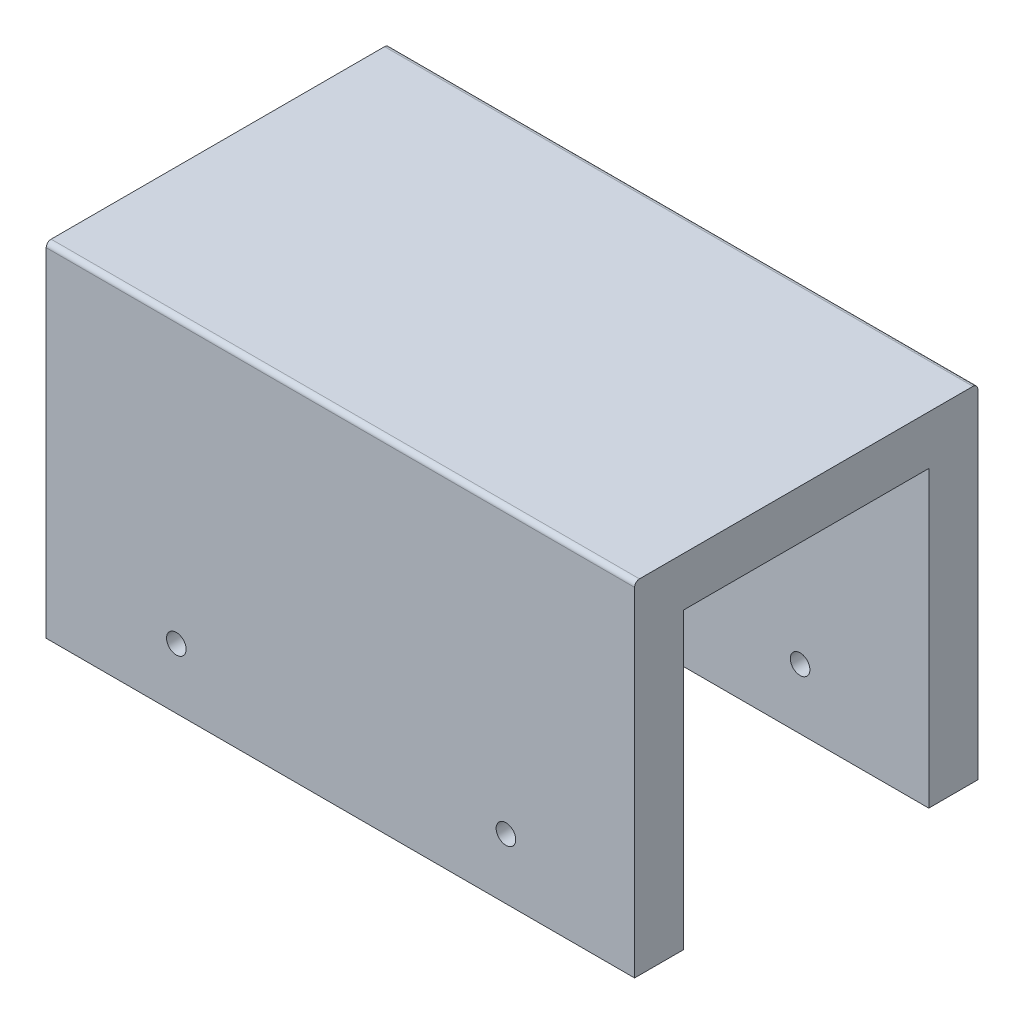
ISO-10303-21;
HEADER;
FILE_DESCRIPTION(('STEP AP214'),'2;1');
FILE_NAME('part.step','',(''),(''),'','','');
FILE_SCHEMA(('AUTOMOTIVE_DESIGN { 1 0 10303 214 1 1 1 1 }'));
ENDSEC;
DATA;
#1=APPLICATION_CONTEXT('core data for automotive mechanical design processes');
#2=APPLICATION_PROTOCOL_DEFINITION('international standard','automotive_design',2000,#1);
#3=PRODUCT_CONTEXT('',#1,'mechanical');
#4=PRODUCT('Part','Part','',(#3));
#5=PRODUCT_RELATED_PRODUCT_CATEGORY('part','',(#4));
#6=PRODUCT_DEFINITION_FORMATION('','',#4);
#7=PRODUCT_DEFINITION_CONTEXT('part definition',#1,'design');
#8=PRODUCT_DEFINITION('design','',#6,#7);
#9=PRODUCT_DEFINITION_SHAPE('','',#8);
#10=(LENGTH_UNIT() NAMED_UNIT(*) SI_UNIT(.MILLI.,.METRE.));
#11=(NAMED_UNIT(*) PLANE_ANGLE_UNIT() SI_UNIT($,.RADIAN.));
#12=(NAMED_UNIT(*) SI_UNIT($,.STERADIAN.) SOLID_ANGLE_UNIT());
#13=UNCERTAINTY_MEASURE_WITH_UNIT(LENGTH_MEASURE(1.E-05),#10,'distance_accuracy_value','');
#14=(GEOMETRIC_REPRESENTATION_CONTEXT(3) GLOBAL_UNCERTAINTY_ASSIGNED_CONTEXT((#13)) GLOBAL_UNIT_ASSIGNED_CONTEXT((#10,
#11,#12)) REPRESENTATION_CONTEXT('',''));
#15=CARTESIAN_POINT('',(0.,0.,0.));
#16=DIRECTION('',(0.,0.,1.));
#17=DIRECTION('',(1.,0.,0.));
#18=AXIS2_PLACEMENT_3D('',#15,#16,#17);
#19=CARTESIAN_POINT('',(120.,30.,35.));
#20=DIRECTION('',(0.,0.,-1.));
#21=DIRECTION('',(0.,1.,0.));
#22=AXIS2_PLACEMENT_3D('',#19,#20,#21);
#23=PLANE('',#22);
#24=CARTESIAN_POINT('',(26.5365882308363,-17.6864508813161,35.));
#25=DIRECTION('',(0.,0.,1.));
#26=DIRECTION('',(1.,0.,0.));
#27=AXIS2_PLACEMENT_3D('',#24,#25,#26);
#28=CIRCLE('',#27,2.);
#29=CARTESIAN_POINT('',(28.5365882308363,-17.6864508813161,35.));
#30=VERTEX_POINT('',#29);
#31=EDGE_CURVE('E280',#30,#30,#28,.T.);
#32=ORIENTED_EDGE('',*,*,#31,.F.);
#33=EDGE_LOOP('',(#32));
#34=FACE_BOUND('',#33,.T.);
#35=CARTESIAN_POINT('',(93.7613222804893,-17.6864508813161,35.));
#36=DIRECTION('',(0.,0.,1.));
#37=DIRECTION('',(1.,0.,0.));
#38=AXIS2_PLACEMENT_3D('',#35,#36,#37);
#39=CIRCLE('',#38,2.);
#40=CARTESIAN_POINT('',(95.7613222804893,-17.6864508813161,35.));
#41=VERTEX_POINT('',#40);
#42=EDGE_CURVE('E282',#41,#41,#39,.T.);
#43=ORIENTED_EDGE('',*,*,#42,.F.);
#44=EDGE_LOOP('',(#43));
#45=FACE_BOUND('',#44,.T.);
#46=DIRECTION('',(0.,-1.,0.));
#47=VECTOR('',#46,1.);
#48=CARTESIAN_POINT('',(120.,30.,35.));
#49=LINE('',#48,#47);
#50=CARTESIAN_POINT('',(120.,39.,35.));
#51=VERTEX_POINT('',#50);
#52=CARTESIAN_POINT('',(120.,-30.,35.));
#53=VERTEX_POINT('',#52);
#54=EDGE_CURVE('E117',#51,#53,#49,.T.);
#55=ORIENTED_EDGE('',*,*,#54,.F.);
#56=DIRECTION('',(-1.,0.,0.));
#57=VECTOR('',#56,1.);
#58=CARTESIAN_POINT('',(120.,39.,35.));
#59=LINE('',#58,#57);
#60=CARTESIAN_POINT('',(0.,39.,35.));
#61=VERTEX_POINT('',#60);
#62=EDGE_CURVE('E11',#51,#61,#59,.T.);
#63=ORIENTED_EDGE('',*,*,#62,.T.);
#64=DIRECTION('',(0.,-1.,0.));
#65=VECTOR('',#64,1.);
#66=CARTESIAN_POINT('',(0.,30.,35.));
#67=LINE('',#66,#65);
#68=CARTESIAN_POINT('',(0.,-30.,35.));
#69=VERTEX_POINT('',#68);
#70=EDGE_CURVE('E131',#61,#69,#67,.T.);
#71=ORIENTED_EDGE('',*,*,#70,.T.);
#72=DIRECTION('',(-1.,0.,0.));
#73=VECTOR('',#72,1.);
#74=CARTESIAN_POINT('',(120.,-30.,35.));
#75=LINE('',#74,#73);
#76=EDGE_CURVE('E129',#53,#69,#75,.T.);
#77=ORIENTED_EDGE('',*,*,#76,.F.);
#78=EDGE_LOOP('',(#55,#63,#71,#77));
#79=FACE_BOUND('',#78,.T.);
#80=ADVANCED_FACE('F39',(#34,#45,#79),#23,.F.);
#81=CARTESIAN_POINT('',(120.,-30.,25.));
#82=DIRECTION('',(0.,-1.,0.));
#83=DIRECTION('',(0.,0.,-1.));
#84=AXIS2_PLACEMENT_3D('',#81,#82,#83);
#85=PLANE('',#84);
#86=DIRECTION('',(0.,0.,1.));
#87=VECTOR('',#86,1.);
#88=CARTESIAN_POINT('',(0.,-30.,25.));
#89=LINE('',#88,#87);
#90=CARTESIAN_POINT('',(0.,-30.,25.));
#91=VERTEX_POINT('',#90);
#92=EDGE_CURVE('E159',#91,#69,#89,.T.);
#93=ORIENTED_EDGE('',*,*,#92,.F.);
#94=DIRECTION('',(-1.,0.,0.));
#95=VECTOR('',#94,1.);
#96=CARTESIAN_POINT('',(120.,-30.,25.));
#97=LINE('',#96,#95);
#98=CARTESIAN_POINT('',(120.,-30.,25.));
#99=VERTEX_POINT('',#98);
#100=EDGE_CURVE('E136',#99,#91,#97,.T.);
#101=ORIENTED_EDGE('',*,*,#100,.F.);
#102=DIRECTION('',(0.,0.,1.));
#103=VECTOR('',#102,1.);
#104=CARTESIAN_POINT('',(120.,-30.,25.));
#105=LINE('',#104,#103);
#106=EDGE_CURVE('E122',#99,#53,#105,.T.);
#107=ORIENTED_EDGE('',*,*,#106,.T.);
#108=ORIENTED_EDGE('',*,*,#76,.T.);
#109=EDGE_LOOP('',(#93,#101,#107,#108));
#110=FACE_BOUND('',#109,.T.);
#111=ADVANCED_FACE('F138',(#110),#85,.T.);
#112=CARTESIAN_POINT('',(120.,30.,25.));
#113=DIRECTION('',(0.,0.,-1.));
#114=DIRECTION('',(0.,1.,0.));
#115=AXIS2_PLACEMENT_3D('',#112,#113,#114);
#116=PLANE('',#115);
#117=CARTESIAN_POINT('',(26.5365882308363,-17.6864508813161,25.));
#118=DIRECTION('',(0.,0.,-1.));
#119=DIRECTION('',(0.,1.,0.));
#120=AXIS2_PLACEMENT_3D('',#117,#118,#119);
#121=CIRCLE('',#120,2.);
#122=CARTESIAN_POINT('',(26.5365882308363,-15.6864508813161,25.));
#123=VERTEX_POINT('',#122);
#124=EDGE_CURVE('E160',#123,#123,#121,.T.);
#125=ORIENTED_EDGE('',*,*,#124,.F.);
#126=EDGE_LOOP('',(#125));
#127=FACE_BOUND('',#126,.T.);
#128=CARTESIAN_POINT('',(93.7613222804893,-17.6864508813161,25.));
#129=DIRECTION('',(0.,0.,-1.));
#130=DIRECTION('',(0.,1.,0.));
#131=AXIS2_PLACEMENT_3D('',#128,#129,#130);
#132=CIRCLE('',#131,2.);
#133=CARTESIAN_POINT('',(93.7613222804893,-15.6864508813161,25.));
#134=VERTEX_POINT('',#133);
#135=EDGE_CURVE('E295',#134,#134,#132,.T.);
#136=ORIENTED_EDGE('',*,*,#135,.F.);
#137=EDGE_LOOP('',(#136));
#138=FACE_BOUND('',#137,.T.);
#139=DIRECTION('',(0.,-1.,0.));
#140=VECTOR('',#139,1.);
#141=CARTESIAN_POINT('',(0.,30.,25.));
#142=LINE('',#141,#140);
#143=CARTESIAN_POINT('',(0.,30.,25.));
#144=VERTEX_POINT('',#143);
#145=EDGE_CURVE('E162',#144,#91,#142,.T.);
#146=ORIENTED_EDGE('',*,*,#145,.F.);
#147=DIRECTION('',(-1.,0.,0.));
#148=VECTOR('',#147,1.);
#149=CARTESIAN_POINT('',(120.,30.,25.));
#150=LINE('',#149,#148);
#151=CARTESIAN_POINT('',(120.,30.,25.));
#152=VERTEX_POINT('',#151);
#153=EDGE_CURVE('E183',#152,#144,#150,.T.);
#154=ORIENTED_EDGE('',*,*,#153,.F.);
#155=DIRECTION('',(0.,-1.,0.));
#156=VECTOR('',#155,1.);
#157=CARTESIAN_POINT('',(120.,30.,25.));
#158=LINE('',#157,#156);
#159=EDGE_CURVE('E139',#152,#99,#158,.T.);
#160=ORIENTED_EDGE('',*,*,#159,.T.);
#161=ORIENTED_EDGE('',*,*,#100,.T.);
#162=EDGE_LOOP('',(#146,#154,#160,#161));
#163=FACE_BOUND('',#162,.T.);
#164=ADVANCED_FACE('F222',(#127,#138,#163),#116,.T.);
#165=CARTESIAN_POINT('',(120.,30.,25.));
#166=DIRECTION('',(0.,-1.,0.));
#167=DIRECTION('',(0.,0.,-1.));
#168=AXIS2_PLACEMENT_3D('',#165,#166,#167);
#169=PLANE('',#168);
#170=DIRECTION('',(0.,0.,1.));
#171=VECTOR('',#170,1.);
#172=CARTESIAN_POINT('',(0.,30.,25.));
#173=LINE('',#172,#171);
#174=CARTESIAN_POINT('',(0.,30.,-25.));
#175=VERTEX_POINT('',#174);
#176=EDGE_CURVE('E165',#175,#144,#173,.T.);
#177=ORIENTED_EDGE('',*,*,#176,.F.);
#178=DIRECTION('',(-1.,0.,0.));
#179=VECTOR('',#178,1.);
#180=CARTESIAN_POINT('',(120.,30.,-25.));
#181=LINE('',#180,#179);
#182=CARTESIAN_POINT('',(120.,30.,-25.));
#183=VERTEX_POINT('',#182);
#184=EDGE_CURVE('E181',#183,#175,#181,.T.);
#185=ORIENTED_EDGE('',*,*,#184,.F.);
#186=DIRECTION('',(0.,0.,1.));
#187=VECTOR('',#186,1.);
#188=CARTESIAN_POINT('',(120.,30.,25.));
#189=LINE('',#188,#187);
#190=EDGE_CURVE('E141',#183,#152,#189,.T.);
#191=ORIENTED_EDGE('',*,*,#190,.T.);
#192=ORIENTED_EDGE('',*,*,#153,.T.);
#193=EDGE_LOOP('',(#177,#185,#191,#192));
#194=FACE_BOUND('',#193,.T.);
#195=ADVANCED_FACE('F219',(#194),#169,.T.);
#196=CARTESIAN_POINT('',(120.,30.,-25.));
#197=DIRECTION('',(0.,0.,1.));
#198=DIRECTION('',(0.,-1.,0.));
#199=AXIS2_PLACEMENT_3D('',#196,#197,#198);
#200=PLANE('',#199);
#201=CARTESIAN_POINT('',(26.5365882308363,-17.6864508813161,-25.));
#202=DIRECTION('',(0.,0.,1.));
#203=DIRECTION('',(0.,-1.,0.));
#204=AXIS2_PLACEMENT_3D('',#201,#202,#203);
#205=CIRCLE('',#204,2.);
#206=CARTESIAN_POINT('',(26.5365882308363,-19.6864508813161,-25.));
#207=VERTEX_POINT('',#206);
#208=EDGE_CURVE('E298',#207,#207,#205,.T.);
#209=ORIENTED_EDGE('',*,*,#208,.F.);
#210=EDGE_LOOP('',(#209));
#211=FACE_BOUND('',#210,.T.);
#212=CARTESIAN_POINT('',(93.7613222804893,-17.6864508813161,-25.));
#213=DIRECTION('',(0.,0.,1.));
#214=DIRECTION('',(0.,-1.,0.));
#215=AXIS2_PLACEMENT_3D('',#212,#213,#214);
#216=CIRCLE('',#215,2.);
#217=CARTESIAN_POINT('',(93.7613222804893,-19.6864508813161,-25.));
#218=VERTEX_POINT('',#217);
#219=EDGE_CURVE('E285',#218,#218,#216,.T.);
#220=ORIENTED_EDGE('',*,*,#219,.F.);
#221=EDGE_LOOP('',(#220));
#222=FACE_BOUND('',#221,.T.);
#223=DIRECTION('',(0.,1.,0.));
#224=VECTOR('',#223,1.);
#225=CARTESIAN_POINT('',(0.,30.,-25.));
#226=LINE('',#225,#224);
#227=CARTESIAN_POINT('',(0.,-30.,-25.));
#228=VERTEX_POINT('',#227);
#229=EDGE_CURVE('E168',#228,#175,#226,.T.);
#230=ORIENTED_EDGE('',*,*,#229,.F.);
#231=DIRECTION('',(-1.,0.,0.));
#232=VECTOR('',#231,1.);
#233=CARTESIAN_POINT('',(120.,-30.,-25.));
#234=LINE('',#233,#232);
#235=CARTESIAN_POINT('',(120.,-30.,-25.));
#236=VERTEX_POINT('',#235);
#237=EDGE_CURVE('E179',#236,#228,#234,.T.);
#238=ORIENTED_EDGE('',*,*,#237,.F.);
#239=DIRECTION('',(0.,1.,0.));
#240=VECTOR('',#239,1.);
#241=CARTESIAN_POINT('',(120.,30.,-25.));
#242=LINE('',#241,#240);
#243=EDGE_CURVE('E147',#236,#183,#242,.T.);
#244=ORIENTED_EDGE('',*,*,#243,.T.);
#245=ORIENTED_EDGE('',*,*,#184,.T.);
#246=EDGE_LOOP('',(#230,#238,#244,#245));
#247=FACE_BOUND('',#246,.T.);
#248=ADVANCED_FACE('F215',(#211,#222,#247),#200,.T.);
#249=CARTESIAN_POINT('',(120.,-30.,-35.));
#250=DIRECTION('',(0.,-1.,0.));
#251=DIRECTION('',(0.,0.,-1.));
#252=AXIS2_PLACEMENT_3D('',#249,#250,#251);
#253=PLANE('',#252);
#254=DIRECTION('',(0.,0.,1.));
#255=VECTOR('',#254,1.);
#256=CARTESIAN_POINT('',(0.,-30.,-35.));
#257=LINE('',#256,#255);
#258=CARTESIAN_POINT('',(0.,-30.,-35.));
#259=VERTEX_POINT('',#258);
#260=EDGE_CURVE('E171',#259,#228,#257,.T.);
#261=ORIENTED_EDGE('',*,*,#260,.F.);
#262=DIRECTION('',(-1.,0.,0.));
#263=VECTOR('',#262,1.);
#264=CARTESIAN_POINT('',(120.,-30.,-35.));
#265=LINE('',#264,#263);
#266=CARTESIAN_POINT('',(120.,-30.,-35.));
#267=VERTEX_POINT('',#266);
#268=EDGE_CURVE('E157',#267,#259,#265,.T.);
#269=ORIENTED_EDGE('',*,*,#268,.F.);
#270=DIRECTION('',(0.,0.,1.));
#271=VECTOR('',#270,1.);
#272=CARTESIAN_POINT('',(120.,-30.,-35.));
#273=LINE('',#272,#271);
#274=EDGE_CURVE('E150',#267,#236,#273,.T.);
#275=ORIENTED_EDGE('',*,*,#274,.T.);
#276=ORIENTED_EDGE('',*,*,#237,.T.);
#277=EDGE_LOOP('',(#261,#269,#275,#276));
#278=FACE_BOUND('',#277,.T.);
#279=ADVANCED_FACE('F211',(#278),#253,.T.);
#280=CARTESIAN_POINT('',(120.,30.,-35.));
#281=DIRECTION('',(0.,0.,1.));
#282=DIRECTION('',(0.,-1.,0.));
#283=AXIS2_PLACEMENT_3D('',#280,#281,#282);
#284=PLANE('',#283);
#285=CARTESIAN_POINT('',(26.5365882308363,-17.6864508813161,-35.));
#286=DIRECTION('',(0.,0.,1.));
#287=DIRECTION('',(1.,0.,0.));
#288=AXIS2_PLACEMENT_3D('',#285,#286,#287);
#289=CIRCLE('',#288,2.);
#290=CARTESIAN_POINT('',(28.5365882308363,-17.6864508813161,-35.));
#291=VERTEX_POINT('',#290);
#292=EDGE_CURVE('E281',#291,#291,#289,.T.);
#293=ORIENTED_EDGE('',*,*,#292,.T.);
#294=EDGE_LOOP('',(#293));
#295=FACE_BOUND('',#294,.T.);
#296=CARTESIAN_POINT('',(93.7613222804893,-17.6864508813161,-35.));
#297=DIRECTION('',(0.,0.,1.));
#298=DIRECTION('',(1.,0.,0.));
#299=AXIS2_PLACEMENT_3D('',#296,#297,#298);
#300=CIRCLE('',#299,2.);
#301=CARTESIAN_POINT('',(95.7613222804893,-17.6864508813161,-35.));
#302=VERTEX_POINT('',#301);
#303=EDGE_CURVE('E288',#302,#302,#300,.T.);
#304=ORIENTED_EDGE('',*,*,#303,.T.);
#305=EDGE_LOOP('',(#304));
#306=FACE_BOUND('',#305,.T.);
#307=DIRECTION('',(0.,1.,0.));
#308=VECTOR('',#307,1.);
#309=CARTESIAN_POINT('',(0.,30.,-35.));
#310=LINE('',#309,#308);
#311=CARTESIAN_POINT('',(0.,39.,-35.));
#312=VERTEX_POINT('',#311);
#313=EDGE_CURVE('E174',#259,#312,#310,.T.);
#314=ORIENTED_EDGE('',*,*,#313,.T.);
#315=DIRECTION('',(-1.,0.,0.));
#316=VECTOR('',#315,1.);
#317=CARTESIAN_POINT('',(120.,39.,-35.));
#318=LINE('',#317,#316);
#319=CARTESIAN_POINT('',(120.,39.,-35.));
#320=VERTEX_POINT('',#319);
#321=EDGE_CURVE('E62',#312,#320,#318,.F.);
#322=ORIENTED_EDGE('',*,*,#321,.T.);
#323=DIRECTION('',(0.,1.,0.));
#324=VECTOR('',#323,1.);
#325=CARTESIAN_POINT('',(120.,30.,-35.));
#326=LINE('',#325,#324);
#327=EDGE_CURVE('E153',#267,#320,#326,.T.);
#328=ORIENTED_EDGE('',*,*,#327,.F.);
#329=ORIENTED_EDGE('',*,*,#268,.T.);
#330=EDGE_LOOP('',(#314,#322,#328,#329));
#331=FACE_BOUND('',#330,.T.);
#332=ADVANCED_FACE('F209',(#295,#306,#331),#284,.F.);
#333=CARTESIAN_POINT('',(120.,40.,25.));
#334=DIRECTION('',(0.,-1.,0.));
#335=DIRECTION('',(0.,0.,-1.));
#336=AXIS2_PLACEMENT_3D('',#333,#334,#335);
#337=PLANE('',#336);
#338=DIRECTION('',(0.,0.,-1.));
#339=VECTOR('',#338,1.);
#340=CARTESIAN_POINT('',(120.,40.,25.));
#341=LINE('',#340,#339);
#342=CARTESIAN_POINT('',(120.,40.,-34.));
#343=VERTEX_POINT('',#342);
#344=CARTESIAN_POINT('',(120.,40.,34.));
#345=VERTEX_POINT('',#344);
#346=EDGE_CURVE('E155',#343,#345,#341,.F.);
#347=ORIENTED_EDGE('',*,*,#346,.F.);
#348=DIRECTION('',(-1.,0.,0.));
#349=VECTOR('',#348,1.);
#350=CARTESIAN_POINT('',(120.,40.,-34.));
#351=LINE('',#350,#349);
#352=CARTESIAN_POINT('',(0.,40.,-34.));
#353=VERTEX_POINT('',#352);
#354=EDGE_CURVE('E187',#343,#353,#351,.T.);
#355=ORIENTED_EDGE('',*,*,#354,.T.);
#356=DIRECTION('',(0.,0.,-1.));
#357=VECTOR('',#356,1.);
#358=CARTESIAN_POINT('',(0.,40.,25.));
#359=LINE('',#358,#357);
#360=CARTESIAN_POINT('',(0.,40.,34.));
#361=VERTEX_POINT('',#360);
#362=EDGE_CURVE('E126',#353,#361,#359,.F.);
#363=ORIENTED_EDGE('',*,*,#362,.T.);
#364=DIRECTION('',(-1.,0.,0.));
#365=VECTOR('',#364,1.);
#366=CARTESIAN_POINT('',(120.,40.,34.));
#367=LINE('',#366,#365);
#368=EDGE_CURVE('E135',#361,#345,#367,.F.);
#369=ORIENTED_EDGE('',*,*,#368,.T.);
#370=EDGE_LOOP('',(#347,#355,#363,#369));
#371=FACE_BOUND('',#370,.T.);
#372=ADVANCED_FACE('F201',(#371),#337,.F.);
#373=CARTESIAN_POINT('',(120.,0.,0.));
#374=DIRECTION('',(-1.,0.,0.));
#375=DIRECTION('',(0.,0.,1.));
#376=AXIS2_PLACEMENT_3D('',#373,#374,#375);
#377=PLANE('',#376);
#378=ORIENTED_EDGE('',*,*,#327,.T.);
#379=CARTESIAN_POINT('',(120.,39.,-34.));
#380=DIRECTION('',(-1.,0.,0.));
#381=DIRECTION('',(0.,0.,1.));
#382=AXIS2_PLACEMENT_3D('',#379,#380,#381);
#383=CIRCLE('',#382,1.);
#384=EDGE_CURVE('E47',#320,#343,#383,.F.);
#385=ORIENTED_EDGE('',*,*,#384,.T.);
#386=ORIENTED_EDGE('',*,*,#346,.T.);
#387=CARTESIAN_POINT('',(120.,39.,34.));
#388=DIRECTION('',(-1.,0.,0.));
#389=DIRECTION('',(0.,0.,1.));
#390=AXIS2_PLACEMENT_3D('',#387,#388,#389);
#391=CIRCLE('',#390,1.);
#392=EDGE_CURVE('E54',#345,#51,#391,.F.);
#393=ORIENTED_EDGE('',*,*,#392,.T.);
#394=ORIENTED_EDGE('',*,*,#54,.T.);
#395=ORIENTED_EDGE('',*,*,#106,.F.);
#396=ORIENTED_EDGE('',*,*,#159,.F.);
#397=ORIENTED_EDGE('',*,*,#190,.F.);
#398=ORIENTED_EDGE('',*,*,#243,.F.);
#399=ORIENTED_EDGE('',*,*,#274,.F.);
#400=EDGE_LOOP('',(#378,#385,#386,#393,#394,#395,#396,#397,#398,#399));
#401=FACE_BOUND('',#400,.T.);
#402=ADVANCED_FACE('F119',(#401),#377,.F.);
#403=CARTESIAN_POINT('',(0.,0.,0.));
#404=DIRECTION('',(-1.,0.,0.));
#405=DIRECTION('',(0.,0.,1.));
#406=AXIS2_PLACEMENT_3D('',#403,#404,#405);
#407=PLANE('',#406);
#408=ORIENTED_EDGE('',*,*,#362,.F.);
#409=CARTESIAN_POINT('',(0.,39.,-34.));
#410=DIRECTION('',(-1.,0.,0.));
#411=DIRECTION('',(0.,0.,1.));
#412=AXIS2_PLACEMENT_3D('',#409,#410,#411);
#413=CIRCLE('',#412,1.);
#414=EDGE_CURVE('E192',#353,#312,#413,.T.);
#415=ORIENTED_EDGE('',*,*,#414,.T.);
#416=ORIENTED_EDGE('',*,*,#313,.F.);
#417=ORIENTED_EDGE('',*,*,#260,.T.);
#418=ORIENTED_EDGE('',*,*,#229,.T.);
#419=ORIENTED_EDGE('',*,*,#176,.T.);
#420=ORIENTED_EDGE('',*,*,#145,.T.);
#421=ORIENTED_EDGE('',*,*,#92,.T.);
#422=ORIENTED_EDGE('',*,*,#70,.F.);
#423=CARTESIAN_POINT('',(0.,39.,34.));
#424=DIRECTION('',(-1.,0.,0.));
#425=DIRECTION('',(0.,0.,1.));
#426=AXIS2_PLACEMENT_3D('',#423,#424,#425);
#427=CIRCLE('',#426,1.);
#428=EDGE_CURVE('E190',#61,#361,#427,.T.);
#429=ORIENTED_EDGE('',*,*,#428,.T.);
#430=EDGE_LOOP('',(#408,#415,#416,#417,#418,#419,#420,#421,#422,#429));
#431=FACE_BOUND('',#430,.T.);
#432=ADVANCED_FACE('F207',(#431),#407,.T.);
#433=CARTESIAN_POINT('',(93.7613222804893,-17.6864508813161,-35.));
#434=DIRECTION('',(0.,0.,1.));
#435=DIRECTION('',(1.,0.,0.));
#436=AXIS2_PLACEMENT_3D('',#433,#434,#435);
#437=CYLINDRICAL_SURFACE('',#436,2.);
#438=ORIENTED_EDGE('',*,*,#219,.T.);
#439=EDGE_LOOP('',(#438));
#440=FACE_BOUND('',#439,.T.);
#441=ORIENTED_EDGE('',*,*,#303,.F.);
#442=EDGE_LOOP('',(#441));
#443=FACE_BOUND('',#442,.T.);
#444=ADVANCED_FACE('F257',(#440,#443),#437,.F.);
#445=CARTESIAN_POINT('',(26.5365882308363,-17.6864508813161,-35.));
#446=DIRECTION('',(0.,0.,1.));
#447=DIRECTION('',(1.,0.,0.));
#448=AXIS2_PLACEMENT_3D('',#445,#446,#447);
#449=CYLINDRICAL_SURFACE('',#448,2.);
#450=ORIENTED_EDGE('',*,*,#208,.T.);
#451=EDGE_LOOP('',(#450));
#452=FACE_BOUND('',#451,.T.);
#453=ORIENTED_EDGE('',*,*,#292,.F.);
#454=EDGE_LOOP('',(#453));
#455=FACE_BOUND('',#454,.T.);
#456=ADVANCED_FACE('F262',(#452,#455),#449,.F.);
#457=ORIENTED_EDGE('',*,*,#135,.T.);
#458=EDGE_LOOP('',(#457));
#459=FACE_BOUND('',#458,.T.);
#460=ORIENTED_EDGE('',*,*,#42,.T.);
#461=EDGE_LOOP('',(#460));
#462=FACE_BOUND('',#461,.T.);
#463=ADVANCED_FACE('F264',(#459,#462),#437,.F.);
#464=ORIENTED_EDGE('',*,*,#124,.T.);
#465=EDGE_LOOP('',(#464));
#466=FACE_BOUND('',#465,.T.);
#467=ORIENTED_EDGE('',*,*,#31,.T.);
#468=EDGE_LOOP('',(#467));
#469=FACE_BOUND('',#468,.T.);
#470=ADVANCED_FACE('F228',(#466,#469),#449,.F.);
#471=CARTESIAN_POINT('',(120.,39.,-34.));
#472=DIRECTION('',(-1.,0.,0.));
#473=DIRECTION('',(0.,0.,1.));
#474=AXIS2_PLACEMENT_3D('',#471,#472,#473);
#475=CYLINDRICAL_SURFACE('',#474,1.);
#476=ORIENTED_EDGE('',*,*,#384,.F.);
#477=ORIENTED_EDGE('',*,*,#321,.F.);
#478=ORIENTED_EDGE('',*,*,#414,.F.);
#479=ORIENTED_EDGE('',*,*,#354,.F.);
#480=EDGE_LOOP('',(#476,#477,#478,#479));
#481=FACE_BOUND('',#480,.T.);
#482=ADVANCED_FACE('F204',(#481),#475,.T.);
#483=CARTESIAN_POINT('',(120.,39.,34.));
#484=DIRECTION('',(-1.,0.,0.));
#485=DIRECTION('',(0.,0.,1.));
#486=AXIS2_PLACEMENT_3D('',#483,#484,#485);
#487=CYLINDRICAL_SURFACE('',#486,1.);
#488=ORIENTED_EDGE('',*,*,#392,.F.);
#489=ORIENTED_EDGE('',*,*,#368,.F.);
#490=ORIENTED_EDGE('',*,*,#428,.F.);
#491=ORIENTED_EDGE('',*,*,#62,.F.);
#492=EDGE_LOOP('',(#488,#489,#490,#491));
#493=FACE_BOUND('',#492,.T.);
#494=ADVANCED_FACE('F41',(#493),#487,.T.);
#495=CLOSED_SHELL('',(#80,#111,#164,#195,#248,#279,#332,#372,#402,#432,#444,#456,#463,#470,#482,#494));
#496=MANIFOLD_SOLID_BREP('B2',#495);
#497=ADVANCED_BREP_SHAPE_REPRESENTATION('',(#18,#496),#14);
#498=SHAPE_DEFINITION_REPRESENTATION(#9,#497);
ENDSEC;
END-ISO-10303-21;
